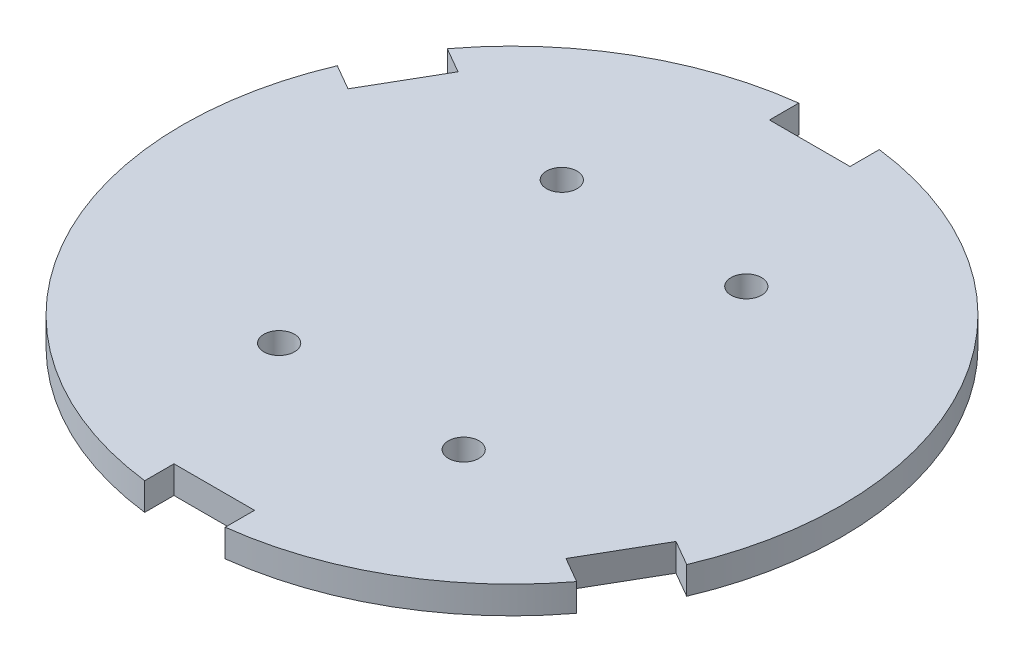
ISO-10303-21;
HEADER;
FILE_DESCRIPTION(('STEP AP214'),'2;1');
FILE_NAME('part.step','',(''),(''),'','','');
FILE_SCHEMA(('AUTOMOTIVE_DESIGN { 1 0 10303 214 1 1 1 1 }'));
ENDSEC;
DATA;
#1=APPLICATION_CONTEXT('core data for automotive mechanical design processes');
#2=APPLICATION_PROTOCOL_DEFINITION('international standard','automotive_design',2000,#1);
#3=PRODUCT_CONTEXT('',#1,'mechanical');
#4=PRODUCT('Part','Part','',(#3));
#5=PRODUCT_RELATED_PRODUCT_CATEGORY('part','',(#4));
#6=PRODUCT_DEFINITION_FORMATION('','',#4);
#7=PRODUCT_DEFINITION_CONTEXT('part definition',#1,'design');
#8=PRODUCT_DEFINITION('design','',#6,#7);
#9=PRODUCT_DEFINITION_SHAPE('','',#8);
#10=(LENGTH_UNIT() NAMED_UNIT(*) SI_UNIT(.MILLI.,.METRE.));
#11=(NAMED_UNIT(*) PLANE_ANGLE_UNIT() SI_UNIT($,.RADIAN.));
#12=(NAMED_UNIT(*) SI_UNIT($,.STERADIAN.) SOLID_ANGLE_UNIT());
#13=UNCERTAINTY_MEASURE_WITH_UNIT(LENGTH_MEASURE(1.E-05),#10,'distance_accuracy_value','');
#14=(GEOMETRIC_REPRESENTATION_CONTEXT(3) GLOBAL_UNCERTAINTY_ASSIGNED_CONTEXT((#13)) GLOBAL_UNIT_ASSIGNED_CONTEXT((#10,
#11,#12)) REPRESENTATION_CONTEXT('',''));
#15=CARTESIAN_POINT('',(0.,0.,0.));
#16=DIRECTION('',(0.,0.,1.));
#17=DIRECTION('',(1.,0.,0.));
#18=AXIS2_PLACEMENT_3D('',#15,#16,#17);
#19=CARTESIAN_POINT('',(0.,4.7625,0.));
#20=DIRECTION('',(0.,-1.,0.));
#21=DIRECTION('',(0.,0.,-1.));
#22=AXIS2_PLACEMENT_3D('',#19,#20,#21);
#23=CYLINDRICAL_SURFACE('',#22,57.15);
#24=CARTESIAN_POINT('',(0.,4.7625,0.));
#25=DIRECTION('',(0.,1.,0.));
#26=DIRECTION('',(0.,0.,1.));
#27=AXIS2_PLACEMENT_3D('',#24,#25,#26);
#28=CIRCLE('',#27,57.15);
#29=CARTESIAN_POINT('',(-52.6147882839347,4.7625,-22.3115789185061));
#30=VERTEX_POINT('',#29);
#31=CARTESIAN_POINT('',(-6.98500000000002,4.7625,56.7215327278803));
#32=VERTEX_POINT('',#31);
#33=EDGE_CURVE('E48',#30,#32,#28,.T.);
#34=ORIENTED_EDGE('',*,*,#33,.F.);
#35=DIRECTION('',(0.,1.,0.));
#36=VECTOR('',#35,1.);
#37=CARTESIAN_POINT('',(-52.6147882839347,-0.00100000000000013,-22.3115789185061));
#38=LINE('',#37,#36);
#39=CARTESIAN_POINT('',(-52.6147882839347,0.,-22.3115789185061));
#40=VERTEX_POINT('',#39);
#41=EDGE_CURVE('E259',#40,#30,#38,.T.);
#42=ORIENTED_EDGE('',*,*,#41,.F.);
#43=CARTESIAN_POINT('',(0.,0.,0.));
#44=DIRECTION('',(0.,1.,0.));
#45=DIRECTION('',(0.,0.,1.));
#46=AXIS2_PLACEMENT_3D('',#43,#44,#45);
#47=CIRCLE('',#46,57.15);
#48=CARTESIAN_POINT('',(-6.98500000000002,0.,56.7215327278803));
#49=VERTEX_POINT('',#48);
#50=EDGE_CURVE('E178',#40,#49,#47,.T.);
#51=ORIENTED_EDGE('',*,*,#50,.T.);
#52=DIRECTION('',(0.,1.,0.));
#53=VECTOR('',#52,1.);
#54=CARTESIAN_POINT('',(-6.98500000000002,-0.00100000000000013,56.7215327278803));
#55=LINE('',#54,#53);
#56=EDGE_CURVE('E201',#49,#32,#55,.T.);
#57=ORIENTED_EDGE('',*,*,#56,.T.);
#58=EDGE_LOOP('',(#34,#42,#51,#57));
#59=FACE_BOUND('',#58,.T.);
#60=ADVANCED_FACE('F38',(#59),#23,.T.);
#61=CARTESIAN_POINT('',(6.98500000000001,0.,56.7215327278803));
#62=VERTEX_POINT('',#61);
#63=CARTESIAN_POINT('',(45.6297882839347,0.,34.4099538093747));
#64=VERTEX_POINT('',#63);
#65=EDGE_CURVE('E42',#62,#64,#47,.T.);
#66=ORIENTED_EDGE('',*,*,#65,.T.);
#67=DIRECTION('',(0.,1.,0.));
#68=VECTOR('',#67,1.);
#69=CARTESIAN_POINT('',(45.6297882839347,-0.00100000000000013,34.4099538093747));
#70=LINE('',#69,#68);
#71=CARTESIAN_POINT('',(45.6297882839347,4.7625,34.4099538093747));
#72=VERTEX_POINT('',#71);
#73=EDGE_CURVE('E155',#64,#72,#70,.T.);
#74=ORIENTED_EDGE('',*,*,#73,.T.);
#75=CARTESIAN_POINT('',(6.98500000000001,4.7625,56.7215327278803));
#76=VERTEX_POINT('',#75);
#77=EDGE_CURVE('E11',#76,#72,#28,.T.);
#78=ORIENTED_EDGE('',*,*,#77,.F.);
#79=DIRECTION('',(0.,1.,0.));
#80=VECTOR('',#79,1.);
#81=CARTESIAN_POINT('',(6.98500000000001,-0.00100000000000013,56.7215327278803));
#82=LINE('',#81,#80);
#83=EDGE_CURVE('E175',#62,#76,#82,.T.);
#84=ORIENTED_EDGE('',*,*,#83,.F.);
#85=EDGE_LOOP('',(#66,#74,#78,#84));
#86=FACE_BOUND('',#85,.T.);
#87=ADVANCED_FACE('F174',(#86),#23,.T.);
#88=CARTESIAN_POINT('',(-6.98499999999999,0.,-56.7215327278803));
#89=VERTEX_POINT('',#88);
#90=CARTESIAN_POINT('',(-45.6297882839347,0.,-34.4099538093747));
#91=VERTEX_POINT('',#90);
#92=EDGE_CURVE('E177',#89,#91,#47,.T.);
#93=ORIENTED_EDGE('',*,*,#92,.T.);
#94=DIRECTION('',(0.,1.,0.));
#95=VECTOR('',#94,1.);
#96=CARTESIAN_POINT('',(-45.6297882839346,-0.00100000000000013,-34.4099538093747));
#97=LINE('',#96,#95);
#98=CARTESIAN_POINT('',(-45.6297882839346,4.7625,-34.4099538093747));
#99=VERTEX_POINT('',#98);
#100=EDGE_CURVE('E64',#91,#99,#97,.T.);
#101=ORIENTED_EDGE('',*,*,#100,.T.);
#102=CARTESIAN_POINT('',(-6.98499999999999,4.7625,-56.7215327278803));
#103=VERTEX_POINT('',#102);
#104=EDGE_CURVE('E49',#103,#99,#28,.T.);
#105=ORIENTED_EDGE('',*,*,#104,.F.);
#106=DIRECTION('',(0.,1.,0.));
#107=VECTOR('',#106,1.);
#108=CARTESIAN_POINT('',(-6.98499999999999,-0.00100000000000013,-56.7215327278803));
#109=LINE('',#108,#107);
#110=EDGE_CURVE('E222',#89,#103,#109,.T.);
#111=ORIENTED_EDGE('',*,*,#110,.F.);
#112=EDGE_LOOP('',(#93,#101,#105,#111));
#113=FACE_BOUND('',#112,.T.);
#114=ADVANCED_FACE('F285',(#113),#23,.T.);
#115=CARTESIAN_POINT('',(52.6147882839347,4.7625,22.3115789185061));
#116=VERTEX_POINT('',#115);
#117=CARTESIAN_POINT('',(6.98499999999996,4.7625,-56.7215327278803));
#118=VERTEX_POINT('',#117);
#119=EDGE_CURVE('E47',#116,#118,#28,.T.);
#120=ORIENTED_EDGE('',*,*,#119,.F.);
#121=DIRECTION('',(0.,1.,0.));
#122=VECTOR('',#121,1.);
#123=CARTESIAN_POINT('',(52.6147882839347,-0.00100000000000013,22.3115789185061));
#124=LINE('',#123,#122);
#125=CARTESIAN_POINT('',(52.6147882839347,0.,22.3115789185061));
#126=VERTEX_POINT('',#125);
#127=EDGE_CURVE('E164',#126,#116,#124,.T.);
#128=ORIENTED_EDGE('',*,*,#127,.F.);
#129=CARTESIAN_POINT('',(6.98499999999997,0.,-56.7215327278804));
#130=VERTEX_POINT('',#129);
#131=EDGE_CURVE('E176',#126,#130,#47,.T.);
#132=ORIENTED_EDGE('',*,*,#131,.T.);
#133=DIRECTION('',(0.,1.,0.));
#134=VECTOR('',#133,1.);
#135=CARTESIAN_POINT('',(6.98499999999996,-0.00100000000000013,-56.7215327278803));
#136=LINE('',#135,#134);
#137=EDGE_CURVE('E224',#130,#118,#136,.T.);
#138=ORIENTED_EDGE('',*,*,#137,.T.);
#139=EDGE_LOOP('',(#120,#128,#132,#138));
#140=FACE_BOUND('',#139,.T.);
#141=ADVANCED_FACE('F40',(#140),#23,.T.);
#142=CARTESIAN_POINT('',(0.,4.7625,0.));
#143=DIRECTION('',(0.,1.,0.));
#144=DIRECTION('',(0.,0.,1.));
#145=AXIS2_PLACEMENT_3D('',#142,#143,#144);
#146=PLANE('',#145);
#147=CARTESIAN_POINT('',(16.002,4.7625,-24.638));
#148=DIRECTION('',(0.,1.,0.));
#149=DIRECTION('',(0.,0.,1.));
#150=AXIS2_PLACEMENT_3D('',#147,#148,#149);
#151=CIRCLE('',#150,2.6543);
#152=CARTESIAN_POINT('',(16.002,4.7625,-21.9837));
#153=VERTEX_POINT('',#152);
#154=EDGE_CURVE('E355',#153,#153,#151,.T.);
#155=ORIENTED_EDGE('',*,*,#154,.F.);
#156=EDGE_LOOP('',(#155));
#157=FACE_BOUND('',#156,.T.);
#158=CARTESIAN_POINT('',(16.002,4.7625,24.384));
#159=DIRECTION('',(0.,1.,0.));
#160=DIRECTION('',(0.,0.,1.));
#161=AXIS2_PLACEMENT_3D('',#158,#159,#160);
#162=CIRCLE('',#161,2.6543);
#163=CARTESIAN_POINT('',(16.002,4.7625,27.0383));
#164=VERTEX_POINT('',#163);
#165=EDGE_CURVE('E349',#164,#164,#162,.T.);
#166=ORIENTED_EDGE('',*,*,#165,.F.);
#167=EDGE_LOOP('',(#166));
#168=FACE_BOUND('',#167,.T.);
#169=CARTESIAN_POINT('',(-16.002,4.7625,24.384));
#170=DIRECTION('',(0.,1.,0.));
#171=DIRECTION('',(0.,0.,1.));
#172=AXIS2_PLACEMENT_3D('',#169,#170,#171);
#173=CIRCLE('',#172,2.6543);
#174=CARTESIAN_POINT('',(-16.002,4.7625,27.0383));
#175=VERTEX_POINT('',#174);
#176=EDGE_CURVE('E343',#175,#175,#173,.T.);
#177=ORIENTED_EDGE('',*,*,#176,.F.);
#178=EDGE_LOOP('',(#177));
#179=FACE_BOUND('',#178,.T.);
#180=CARTESIAN_POINT('',(-16.002,4.7625,-24.638));
#181=DIRECTION('',(0.,1.,0.));
#182=DIRECTION('',(0.,0.,1.));
#183=AXIS2_PLACEMENT_3D('',#180,#181,#182);
#184=CIRCLE('',#183,2.6543);
#185=CARTESIAN_POINT('',(-16.002,4.7625,-21.9837));
#186=VERTEX_POINT('',#185);
#187=EDGE_CURVE('E337',#186,#186,#184,.T.);
#188=ORIENTED_EDGE('',*,*,#187,.F.);
#189=EDGE_LOOP('',(#188));
#190=FACE_BOUND('',#189,.T.);
#191=DIRECTION('',(0.866025403784436,0.,0.500000000000004));
#192=VECTOR('',#191,1.);
#193=CARTESIAN_POINT('',(41.2303792327097,4.7625,31.8699538093747));
#194=LINE('',#193,#192);
#195=CARTESIAN_POINT('',(41.2303792327097,4.7625,31.8699538093747));
#196=VERTEX_POINT('',#195);
#197=EDGE_CURVE('E160',#196,#72,#194,.T.);
#198=ORIENTED_EDGE('',*,*,#197,.F.);
#199=DIRECTION('',(-0.500000000000024,0.,0.866025403784425));
#200=VECTOR('',#199,1.);
#201=CARTESIAN_POINT('',(41.2303792327097,4.7625,31.8699538093747));
#202=LINE('',#201,#200);
#203=CARTESIAN_POINT('',(48.2153792327101,4.7625,19.7715789185062));
#204=VERTEX_POINT('',#203);
#205=EDGE_CURVE('E165',#204,#196,#202,.T.);
#206=ORIENTED_EDGE('',*,*,#205,.F.);
#207=DIRECTION('',(-0.866025403784436,0.,-0.500000000000005));
#208=VECTOR('',#207,1.);
#209=CARTESIAN_POINT('',(48.2153792327101,4.7625,19.7715789185062));
#210=LINE('',#209,#208);
#211=EDGE_CURVE('E328',#116,#204,#210,.T.);
#212=ORIENTED_EDGE('',*,*,#211,.F.);
#213=ORIENTED_EDGE('',*,*,#119,.T.);
#214=DIRECTION('',(0.,0.,-1.));
#215=VECTOR('',#214,1.);
#216=CARTESIAN_POINT('',(6.98499999999998,4.7625,-51.6415327278803));
#217=LINE('',#216,#215);
#218=CARTESIAN_POINT('',(6.98499999999998,4.7625,-51.6415327278803));
#219=VERTEX_POINT('',#218);
#220=EDGE_CURVE('E212',#219,#118,#217,.T.);
#221=ORIENTED_EDGE('',*,*,#220,.F.);
#222=DIRECTION('',(1.,0.,0.));
#223=VECTOR('',#222,1.);
#224=CARTESIAN_POINT('',(-6.98499999999999,4.7625,-51.6415327278803));
#225=LINE('',#224,#223);
#226=CARTESIAN_POINT('',(-6.98499999999999,4.7625,-51.6415327278803));
#227=VERTEX_POINT('',#226);
#228=EDGE_CURVE('E209',#227,#219,#225,.T.);
#229=ORIENTED_EDGE('',*,*,#228,.F.);
#230=DIRECTION('',(0.,0.,1.));
#231=VECTOR('',#230,1.);
#232=CARTESIAN_POINT('',(-6.98499999999999,4.7625,-51.6415327278803));
#233=LINE('',#232,#231);
#234=EDGE_CURVE('E215',#103,#227,#233,.T.);
#235=ORIENTED_EDGE('',*,*,#234,.F.);
#236=ORIENTED_EDGE('',*,*,#104,.T.);
#237=DIRECTION('',(-0.866025403784435,0.,-0.500000000000005));
#238=VECTOR('',#237,1.);
#239=CARTESIAN_POINT('',(-41.2303792327097,4.7625,-31.8699538093747));
#240=LINE('',#239,#238);
#241=CARTESIAN_POINT('',(-41.2303792327097,4.7625,-31.8699538093747));
#242=VERTEX_POINT('',#241);
#243=EDGE_CURVE('E305',#242,#99,#240,.T.);
#244=ORIENTED_EDGE('',*,*,#243,.F.);
#245=DIRECTION('',(0.500000000000004,0.,-0.866025403784436));
#246=VECTOR('',#245,1.);
#247=CARTESIAN_POINT('',(-48.2153792327098,4.7625,-19.7715789185061));
#248=LINE('',#247,#246);
#249=CARTESIAN_POINT('',(-48.2153792327098,4.7625,-19.7715789185061));
#250=VERTEX_POINT('',#249);
#251=EDGE_CURVE('E314',#250,#242,#248,.T.);
#252=ORIENTED_EDGE('',*,*,#251,.F.);
#253=DIRECTION('',(0.866025403784436,0.,0.500000000000004));
#254=VECTOR('',#253,1.);
#255=CARTESIAN_POINT('',(-48.2153792327098,4.7625,-19.7715789185061));
#256=LINE('',#255,#254);
#257=EDGE_CURVE('E309',#30,#250,#256,.T.);
#258=ORIENTED_EDGE('',*,*,#257,.F.);
#259=ORIENTED_EDGE('',*,*,#33,.T.);
#260=DIRECTION('',(0.,0.,1.));
#261=VECTOR('',#260,1.);
#262=CARTESIAN_POINT('',(-6.98499999999999,4.7625,51.6415327278803));
#263=LINE('',#262,#261);
#264=CARTESIAN_POINT('',(-6.98499999999999,4.7625,51.6415327278803));
#265=VERTEX_POINT('',#264);
#266=EDGE_CURVE('E245',#265,#32,#263,.T.);
#267=ORIENTED_EDGE('',*,*,#266,.F.);
#268=DIRECTION('',(-1.,0.,0.));
#269=VECTOR('',#268,1.);
#270=CARTESIAN_POINT('',(-6.98499999999999,4.7625,51.6415327278803));
#271=LINE('',#270,#269);
#272=CARTESIAN_POINT('',(6.98500000000001,4.7625,51.6415327278803));
#273=VERTEX_POINT('',#272);
#274=EDGE_CURVE('E197',#273,#265,#271,.T.);
#275=ORIENTED_EDGE('',*,*,#274,.F.);
#276=DIRECTION('',(0.,0.,-1.));
#277=VECTOR('',#276,1.);
#278=CARTESIAN_POINT('',(6.98500000000001,4.7625,51.6415327278803));
#279=LINE('',#278,#277);
#280=EDGE_CURVE('E246',#76,#273,#279,.T.);
#281=ORIENTED_EDGE('',*,*,#280,.F.);
#282=ORIENTED_EDGE('',*,*,#77,.T.);
#283=EDGE_LOOP('',(#198,#206,#212,#213,#221,#229,#235,#236,#244,#252,#258,#259,#267,#275,#281,#282));
#284=FACE_BOUND('',#283,.T.);
#285=ADVANCED_FACE('F254',(#157,#168,#179,#190,#284),#146,.T.);
#286=CARTESIAN_POINT('',(0.,0.,0.));
#287=DIRECTION('',(0.,1.,0.));
#288=DIRECTION('',(0.,0.,1.));
#289=AXIS2_PLACEMENT_3D('',#286,#287,#288);
#290=PLANE('',#289);
#291=CARTESIAN_POINT('',(16.002,0.,-24.638));
#292=DIRECTION('',(0.,1.,0.));
#293=DIRECTION('',(0.,0.,1.));
#294=AXIS2_PLACEMENT_3D('',#291,#292,#293);
#295=CIRCLE('',#294,2.6543);
#296=CARTESIAN_POINT('',(16.002,0.,-21.9837));
#297=VERTEX_POINT('',#296);
#298=EDGE_CURVE('E352',#297,#297,#295,.T.);
#299=ORIENTED_EDGE('',*,*,#298,.T.);
#300=EDGE_LOOP('',(#299));
#301=FACE_BOUND('',#300,.T.);
#302=CARTESIAN_POINT('',(16.002,0.,24.384));
#303=DIRECTION('',(0.,1.,0.));
#304=DIRECTION('',(0.,0.,1.));
#305=AXIS2_PLACEMENT_3D('',#302,#303,#304);
#306=CIRCLE('',#305,2.6543);
#307=CARTESIAN_POINT('',(16.002,0.,27.0383));
#308=VERTEX_POINT('',#307);
#309=EDGE_CURVE('E346',#308,#308,#306,.T.);
#310=ORIENTED_EDGE('',*,*,#309,.T.);
#311=EDGE_LOOP('',(#310));
#312=FACE_BOUND('',#311,.T.);
#313=CARTESIAN_POINT('',(-16.002,0.,24.384));
#314=DIRECTION('',(0.,1.,0.));
#315=DIRECTION('',(0.,0.,1.));
#316=AXIS2_PLACEMENT_3D('',#313,#314,#315);
#317=CIRCLE('',#316,2.6543);
#318=CARTESIAN_POINT('',(-16.002,0.,27.0383));
#319=VERTEX_POINT('',#318);
#320=EDGE_CURVE('E340',#319,#319,#317,.T.);
#321=ORIENTED_EDGE('',*,*,#320,.T.);
#322=EDGE_LOOP('',(#321));
#323=FACE_BOUND('',#322,.T.);
#324=CARTESIAN_POINT('',(-16.002,0.,-24.638));
#325=DIRECTION('',(0.,1.,0.));
#326=DIRECTION('',(0.,0.,1.));
#327=AXIS2_PLACEMENT_3D('',#324,#325,#326);
#328=CIRCLE('',#327,2.6543);
#329=CARTESIAN_POINT('',(-16.002,0.,-21.9837));
#330=VERTEX_POINT('',#329);
#331=EDGE_CURVE('E320',#330,#330,#328,.T.);
#332=ORIENTED_EDGE('',*,*,#331,.T.);
#333=EDGE_LOOP('',(#332));
#334=FACE_BOUND('',#333,.T.);
#335=DIRECTION('',(0.500000000000024,0.,-0.866025403784425));
#336=VECTOR('',#335,1.);
#337=CARTESIAN_POINT('',(41.2303792327097,0.,31.8699538093747));
#338=LINE('',#337,#336);
#339=CARTESIAN_POINT('',(41.2303792327097,0.,31.8699538093747));
#340=VERTEX_POINT('',#339);
#341=CARTESIAN_POINT('',(48.2153792327101,0.,19.7715789185062));
#342=VERTEX_POINT('',#341);
#343=EDGE_CURVE('E56',#340,#342,#338,.T.);
#344=ORIENTED_EDGE('',*,*,#343,.F.);
#345=DIRECTION('',(-0.866025403784436,0.,-0.500000000000004));
#346=VECTOR('',#345,1.);
#347=CARTESIAN_POINT('',(41.2303792327097,0.,31.8699538093747));
#348=LINE('',#347,#346);
#349=EDGE_CURVE('E158',#64,#340,#348,.T.);
#350=ORIENTED_EDGE('',*,*,#349,.F.);
#351=ORIENTED_EDGE('',*,*,#65,.F.);
#352=DIRECTION('',(0.,0.,1.));
#353=VECTOR('',#352,1.);
#354=CARTESIAN_POINT('',(6.98500000000001,0.,51.6415327278803));
#355=LINE('',#354,#353);
#356=CARTESIAN_POINT('',(6.98500000000001,0.,51.6415327278803));
#357=VERTEX_POINT('',#356);
#358=EDGE_CURVE('E229',#357,#62,#355,.T.);
#359=ORIENTED_EDGE('',*,*,#358,.F.);
#360=DIRECTION('',(1.,0.,0.));
#361=VECTOR('',#360,1.);
#362=CARTESIAN_POINT('',(-6.98499999999999,0.,51.6415327278803));
#363=LINE('',#362,#361);
#364=CARTESIAN_POINT('',(-6.98499999999999,0.,51.6415327278803));
#365=VERTEX_POINT('',#364);
#366=EDGE_CURVE('E234',#365,#357,#363,.T.);
#367=ORIENTED_EDGE('',*,*,#366,.F.);
#368=DIRECTION('',(0.,0.,-1.));
#369=VECTOR('',#368,1.);
#370=CARTESIAN_POINT('',(-6.98499999999999,0.,51.6415327278803));
#371=LINE('',#370,#369);
#372=EDGE_CURVE('E238',#49,#365,#371,.T.);
#373=ORIENTED_EDGE('',*,*,#372,.F.);
#374=ORIENTED_EDGE('',*,*,#50,.F.);
#375=DIRECTION('',(-0.866025403784436,0.,-0.500000000000004));
#376=VECTOR('',#375,1.);
#377=CARTESIAN_POINT('',(-48.2153792327098,0.,-19.7715789185061));
#378=LINE('',#377,#376);
#379=CARTESIAN_POINT('',(-48.2153792327098,0.,-19.7715789185061));
#380=VERTEX_POINT('',#379);
#381=EDGE_CURVE('E266',#380,#40,#378,.T.);
#382=ORIENTED_EDGE('',*,*,#381,.F.);
#383=DIRECTION('',(-0.500000000000004,0.,0.866025403784436));
#384=VECTOR('',#383,1.);
#385=CARTESIAN_POINT('',(-48.2153792327098,0.,-19.7715789185061));
#386=LINE('',#385,#384);
#387=CARTESIAN_POINT('',(-41.2303792327097,0.,-31.8699538093747));
#388=VERTEX_POINT('',#387);
#389=EDGE_CURVE('E318',#388,#380,#386,.T.);
#390=ORIENTED_EDGE('',*,*,#389,.F.);
#391=DIRECTION('',(0.866025403784435,0.,0.500000000000005));
#392=VECTOR('',#391,1.);
#393=CARTESIAN_POINT('',(-41.2303792327097,0.,-31.8699538093747));
#394=LINE('',#393,#392);
#395=EDGE_CURVE('E241',#91,#388,#394,.T.);
#396=ORIENTED_EDGE('',*,*,#395,.F.);
#397=ORIENTED_EDGE('',*,*,#92,.F.);
#398=DIRECTION('',(0.,0.,-1.));
#399=VECTOR('',#398,1.);
#400=CARTESIAN_POINT('',(-6.98499999999999,0.,-51.6415327278803));
#401=LINE('',#400,#399);
#402=CARTESIAN_POINT('',(-6.98499999999999,0.,-51.6415327278803));
#403=VERTEX_POINT('',#402);
#404=EDGE_CURVE('E206',#403,#89,#401,.T.);
#405=ORIENTED_EDGE('',*,*,#404,.F.);
#406=DIRECTION('',(-1.,0.,0.));
#407=VECTOR('',#406,1.);
#408=CARTESIAN_POINT('',(-6.98499999999999,0.,-51.6415327278803));
#409=LINE('',#408,#407);
#410=CARTESIAN_POINT('',(6.98499999999998,0.,-51.6415327278803));
#411=VERTEX_POINT('',#410);
#412=EDGE_CURVE('E203',#411,#403,#409,.T.);
#413=ORIENTED_EDGE('',*,*,#412,.F.);
#414=DIRECTION('',(0.,0.,1.));
#415=VECTOR('',#414,1.);
#416=CARTESIAN_POINT('',(6.98499999999998,0.,-51.6415327278803));
#417=LINE('',#416,#415);
#418=EDGE_CURVE('E221',#130,#411,#417,.T.);
#419=ORIENTED_EDGE('',*,*,#418,.F.);
#420=ORIENTED_EDGE('',*,*,#131,.F.);
#421=DIRECTION('',(0.866025403784436,0.,0.500000000000005));
#422=VECTOR('',#421,1.);
#423=CARTESIAN_POINT('',(48.2153792327101,0.,19.7715789185062));
#424=LINE('',#423,#422);
#425=EDGE_CURVE('E333',#342,#126,#424,.T.);
#426=ORIENTED_EDGE('',*,*,#425,.F.);
#427=EDGE_LOOP('',(#344,#350,#351,#359,#367,#373,#374,#382,#390,#396,#397,#405,#413,#419,#420,#426));
#428=FACE_BOUND('',#427,.T.);
#429=ADVANCED_FACE('F169',(#301,#312,#323,#334,#428),#290,.F.);
#430=CARTESIAN_POINT('',(-6.98499999999999,-0.00100000000000013,-51.6415327278803));
#431=DIRECTION('',(0.,0.,1.));
#432=DIRECTION('',(1.,0.,0.));
#433=AXIS2_PLACEMENT_3D('',#430,#431,#432);
#434=PLANE('',#433);
#435=ORIENTED_EDGE('',*,*,#412,.T.);
#436=DIRECTION('',(0.,1.,0.));
#437=VECTOR('',#436,1.);
#438=CARTESIAN_POINT('',(-6.98499999999999,-0.00100000000000013,-51.6415327278803));
#439=LINE('',#438,#437);
#440=EDGE_CURVE('E219',#403,#227,#439,.T.);
#441=ORIENTED_EDGE('',*,*,#440,.T.);
#442=ORIENTED_EDGE('',*,*,#228,.T.);
#443=DIRECTION('',(0.,1.,0.));
#444=VECTOR('',#443,1.);
#445=CARTESIAN_POINT('',(6.98499999999998,-0.00100000000000013,-51.6415327278803));
#446=LINE('',#445,#444);
#447=EDGE_CURVE('E218',#411,#219,#446,.T.);
#448=ORIENTED_EDGE('',*,*,#447,.F.);
#449=EDGE_LOOP('',(#435,#441,#442,#448));
#450=FACE_BOUND('',#449,.T.);
#451=ADVANCED_FACE('F400',(#450),#434,.F.);
#452=CARTESIAN_POINT('',(-6.98499999999999,-0.00100000000000013,-51.6415327278803));
#453=DIRECTION('',(-1.,0.,0.));
#454=DIRECTION('',(0.,0.,1.));
#455=AXIS2_PLACEMENT_3D('',#452,#453,#454);
#456=PLANE('',#455);
#457=ORIENTED_EDGE('',*,*,#404,.T.);
#458=ORIENTED_EDGE('',*,*,#110,.T.);
#459=ORIENTED_EDGE('',*,*,#234,.T.);
#460=ORIENTED_EDGE('',*,*,#440,.F.);
#461=EDGE_LOOP('',(#457,#458,#459,#460));
#462=FACE_BOUND('',#461,.T.);
#463=ADVANCED_FACE('F398',(#462),#456,.F.);
#464=CARTESIAN_POINT('',(6.98499999999998,-0.00100000000000013,-51.6415327278803));
#465=DIRECTION('',(1.,0.,0.));
#466=DIRECTION('',(0.,0.,-1.));
#467=AXIS2_PLACEMENT_3D('',#464,#465,#466);
#468=PLANE('',#467);
#469=ORIENTED_EDGE('',*,*,#418,.T.);
#470=ORIENTED_EDGE('',*,*,#447,.T.);
#471=ORIENTED_EDGE('',*,*,#220,.T.);
#472=ORIENTED_EDGE('',*,*,#137,.F.);
#473=EDGE_LOOP('',(#469,#470,#471,#472));
#474=FACE_BOUND('',#473,.T.);
#475=ADVANCED_FACE('F401',(#474),#468,.F.);
#476=CARTESIAN_POINT('',(-6.98499999999999,-0.00100000000000013,51.6415327278803));
#477=DIRECTION('',(-1.,0.,0.));
#478=DIRECTION('',(0.,0.,1.));
#479=AXIS2_PLACEMENT_3D('',#476,#477,#478);
#480=PLANE('',#479);
#481=ORIENTED_EDGE('',*,*,#372,.T.);
#482=DIRECTION('',(0.,1.,0.));
#483=VECTOR('',#482,1.);
#484=CARTESIAN_POINT('',(-6.98499999999999,-0.00100000000000013,51.6415327278803));
#485=LINE('',#484,#483);
#486=EDGE_CURVE('E183',#365,#265,#485,.T.);
#487=ORIENTED_EDGE('',*,*,#486,.T.);
#488=ORIENTED_EDGE('',*,*,#266,.T.);
#489=ORIENTED_EDGE('',*,*,#56,.F.);
#490=EDGE_LOOP('',(#481,#487,#488,#489));
#491=FACE_BOUND('',#490,.T.);
#492=ADVANCED_FACE('F257',(#491),#480,.F.);
#493=CARTESIAN_POINT('',(-6.98499999999999,-0.00100000000000013,51.6415327278803));
#494=DIRECTION('',(0.,0.,-1.));
#495=DIRECTION('',(-1.,0.,0.));
#496=AXIS2_PLACEMENT_3D('',#493,#494,#495);
#497=PLANE('',#496);
#498=ORIENTED_EDGE('',*,*,#366,.T.);
#499=DIRECTION('',(0.,1.,0.));
#500=VECTOR('',#499,1.);
#501=CARTESIAN_POINT('',(6.98500000000001,-0.00100000000000013,51.6415327278803));
#502=LINE('',#501,#500);
#503=EDGE_CURVE('E189',#357,#273,#502,.T.);
#504=ORIENTED_EDGE('',*,*,#503,.T.);
#505=ORIENTED_EDGE('',*,*,#274,.T.);
#506=ORIENTED_EDGE('',*,*,#486,.F.);
#507=EDGE_LOOP('',(#498,#504,#505,#506));
#508=FACE_BOUND('',#507,.T.);
#509=ADVANCED_FACE('F252',(#508),#497,.F.);
#510=CARTESIAN_POINT('',(6.98500000000001,-0.00100000000000013,51.6415327278803));
#511=DIRECTION('',(1.,0.,0.));
#512=DIRECTION('',(0.,0.,-1.));
#513=AXIS2_PLACEMENT_3D('',#510,#511,#512);
#514=PLANE('',#513);
#515=ORIENTED_EDGE('',*,*,#358,.T.);
#516=ORIENTED_EDGE('',*,*,#83,.T.);
#517=ORIENTED_EDGE('',*,*,#280,.T.);
#518=ORIENTED_EDGE('',*,*,#503,.F.);
#519=EDGE_LOOP('',(#515,#516,#517,#518));
#520=FACE_BOUND('',#519,.T.);
#521=ADVANCED_FACE('F268',(#520),#514,.F.);
#522=CARTESIAN_POINT('',(-48.2153792327098,-0.00100000000000013,-19.7715789185061));
#523=DIRECTION('',(0.866025403784436,0.,0.500000000000004));
#524=DIRECTION('',(0.500000000000004,0.,-0.866025403784436));
#525=AXIS2_PLACEMENT_3D('',#522,#523,#524);
#526=PLANE('',#525);
#527=ORIENTED_EDGE('',*,*,#389,.T.);
#528=DIRECTION('',(0.,1.,0.));
#529=VECTOR('',#528,1.);
#530=CARTESIAN_POINT('',(-48.2153792327098,-0.00100000000000013,-19.7715789185061));
#531=LINE('',#530,#529);
#532=EDGE_CURVE('E262',#380,#250,#531,.T.);
#533=ORIENTED_EDGE('',*,*,#532,.T.);
#534=ORIENTED_EDGE('',*,*,#251,.T.);
#535=DIRECTION('',(0.,1.,0.));
#536=VECTOR('',#535,1.);
#537=CARTESIAN_POINT('',(-41.2303792327097,-0.00100000000000013,-31.8699538093747));
#538=LINE('',#537,#536);
#539=EDGE_CURVE('E307',#388,#242,#538,.T.);
#540=ORIENTED_EDGE('',*,*,#539,.F.);
#541=EDGE_LOOP('',(#527,#533,#534,#540));
#542=FACE_BOUND('',#541,.T.);
#543=ADVANCED_FACE('F270',(#542),#526,.F.);
#544=CARTESIAN_POINT('',(-48.2153792327098,-0.00100000000000013,-19.7715789185061));
#545=DIRECTION('',(-0.500000000000004,0.,0.866025403784436));
#546=DIRECTION('',(0.866025403784436,0.,0.500000000000004));
#547=AXIS2_PLACEMENT_3D('',#544,#545,#546);
#548=PLANE('',#547);
#549=ORIENTED_EDGE('',*,*,#381,.T.);
#550=ORIENTED_EDGE('',*,*,#41,.T.);
#551=ORIENTED_EDGE('',*,*,#257,.T.);
#552=ORIENTED_EDGE('',*,*,#532,.F.);
#553=EDGE_LOOP('',(#549,#550,#551,#552));
#554=FACE_BOUND('',#553,.T.);
#555=ADVANCED_FACE('F276',(#554),#548,.F.);
#556=CARTESIAN_POINT('',(-41.2303792327097,-0.00100000000000013,-31.8699538093747));
#557=DIRECTION('',(0.500000000000005,0.,-0.866025403784435));
#558=DIRECTION('',(-0.866025403784435,0.,-0.500000000000005));
#559=AXIS2_PLACEMENT_3D('',#556,#557,#558);
#560=PLANE('',#559);
#561=ORIENTED_EDGE('',*,*,#395,.T.);
#562=ORIENTED_EDGE('',*,*,#539,.T.);
#563=ORIENTED_EDGE('',*,*,#243,.T.);
#564=ORIENTED_EDGE('',*,*,#100,.F.);
#565=EDGE_LOOP('',(#561,#562,#563,#564));
#566=FACE_BOUND('',#565,.T.);
#567=ADVANCED_FACE('F390',(#566),#560,.F.);
#568=CARTESIAN_POINT('',(41.2303792327097,-0.00100000000000013,31.8699538093747));
#569=DIRECTION('',(-0.500000000000004,0.,0.866025403784436));
#570=DIRECTION('',(0.866025403784436,0.,0.500000000000004));
#571=AXIS2_PLACEMENT_3D('',#568,#569,#570);
#572=PLANE('',#571);
#573=ORIENTED_EDGE('',*,*,#349,.T.);
#574=DIRECTION('',(0.,1.,0.));
#575=VECTOR('',#574,1.);
#576=CARTESIAN_POINT('',(41.2303792327097,-0.00100000000000013,31.8699538093747));
#577=LINE('',#576,#575);
#578=EDGE_CURVE('E207',#340,#196,#577,.T.);
#579=ORIENTED_EDGE('',*,*,#578,.T.);
#580=ORIENTED_EDGE('',*,*,#197,.T.);
#581=ORIENTED_EDGE('',*,*,#73,.F.);
#582=EDGE_LOOP('',(#573,#579,#580,#581));
#583=FACE_BOUND('',#582,.T.);
#584=ADVANCED_FACE('F157',(#583),#572,.F.);
#585=CARTESIAN_POINT('',(41.2303792327097,-0.00100000000000013,31.8699538093747));
#586=DIRECTION('',(-0.866025403784425,0.,-0.500000000000024));
#587=DIRECTION('',(-0.500000000000024,0.,0.866025403784425));
#588=AXIS2_PLACEMENT_3D('',#585,#586,#587);
#589=PLANE('',#588);
#590=ORIENTED_EDGE('',*,*,#343,.T.);
#591=DIRECTION('',(0.,1.,0.));
#592=VECTOR('',#591,1.);
#593=CARTESIAN_POINT('',(48.2153792327101,-0.00100000000000013,19.7715789185062));
#594=LINE('',#593,#592);
#595=EDGE_CURVE('E323',#342,#204,#594,.T.);
#596=ORIENTED_EDGE('',*,*,#595,.T.);
#597=ORIENTED_EDGE('',*,*,#205,.T.);
#598=ORIENTED_EDGE('',*,*,#578,.F.);
#599=EDGE_LOOP('',(#590,#596,#597,#598));
#600=FACE_BOUND('',#599,.T.);
#601=ADVANCED_FACE('F380',(#600),#589,.F.);
#602=CARTESIAN_POINT('',(48.2153792327101,-0.00100000000000013,19.7715789185062));
#603=DIRECTION('',(0.500000000000005,0.,-0.866025403784436));
#604=DIRECTION('',(-0.866025403784436,0.,-0.500000000000005));
#605=AXIS2_PLACEMENT_3D('',#602,#603,#604);
#606=PLANE('',#605);
#607=ORIENTED_EDGE('',*,*,#425,.T.);
#608=ORIENTED_EDGE('',*,*,#127,.T.);
#609=ORIENTED_EDGE('',*,*,#211,.T.);
#610=ORIENTED_EDGE('',*,*,#595,.F.);
#611=EDGE_LOOP('',(#607,#608,#609,#610));
#612=FACE_BOUND('',#611,.T.);
#613=ADVANCED_FACE('F370',(#612),#606,.F.);
#614=CARTESIAN_POINT('',(-16.002,4.7625,-24.638));
#615=DIRECTION('',(0.,1.,0.));
#616=DIRECTION('',(0.,0.,1.));
#617=AXIS2_PLACEMENT_3D('',#614,#615,#616);
#618=CYLINDRICAL_SURFACE('',#617,2.6543);
#619=ORIENTED_EDGE('',*,*,#331,.F.);
#620=EDGE_LOOP('',(#619));
#621=FACE_BOUND('',#620,.T.);
#622=ORIENTED_EDGE('',*,*,#187,.T.);
#623=EDGE_LOOP('',(#622));
#624=FACE_BOUND('',#623,.T.);
#625=ADVANCED_FACE('F367',(#621,#624),#618,.F.);
#626=CARTESIAN_POINT('',(-16.002,4.7625,24.384));
#627=DIRECTION('',(0.,1.,0.));
#628=DIRECTION('',(0.,0.,1.));
#629=AXIS2_PLACEMENT_3D('',#626,#627,#628);
#630=CYLINDRICAL_SURFACE('',#629,2.6543);
#631=ORIENTED_EDGE('',*,*,#320,.F.);
#632=EDGE_LOOP('',(#631));
#633=FACE_BOUND('',#632,.T.);
#634=ORIENTED_EDGE('',*,*,#176,.T.);
#635=EDGE_LOOP('',(#634));
#636=FACE_BOUND('',#635,.T.);
#637=ADVANCED_FACE('F369',(#633,#636),#630,.F.);
#638=CARTESIAN_POINT('',(16.002,4.7625,24.384));
#639=DIRECTION('',(0.,1.,0.));
#640=DIRECTION('',(0.,0.,1.));
#641=AXIS2_PLACEMENT_3D('',#638,#639,#640);
#642=CYLINDRICAL_SURFACE('',#641,2.6543);
#643=ORIENTED_EDGE('',*,*,#309,.F.);
#644=EDGE_LOOP('',(#643));
#645=FACE_BOUND('',#644,.T.);
#646=ORIENTED_EDGE('',*,*,#165,.T.);
#647=EDGE_LOOP('',(#646));
#648=FACE_BOUND('',#647,.T.);
#649=ADVANCED_FACE('F377',(#645,#648),#642,.F.);
#650=CARTESIAN_POINT('',(16.002,4.7625,-24.638));
#651=DIRECTION('',(0.,1.,0.));
#652=DIRECTION('',(0.,0.,1.));
#653=AXIS2_PLACEMENT_3D('',#650,#651,#652);
#654=CYLINDRICAL_SURFACE('',#653,2.6543);
#655=ORIENTED_EDGE('',*,*,#298,.F.);
#656=EDGE_LOOP('',(#655));
#657=FACE_BOUND('',#656,.T.);
#658=ORIENTED_EDGE('',*,*,#154,.T.);
#659=EDGE_LOOP('',(#658));
#660=FACE_BOUND('',#659,.T.);
#661=ADVANCED_FACE('F359',(#657,#660),#654,.F.);
#662=CLOSED_SHELL('',(#60,#87,#114,#141,#285,#429,#451,#463,#475,#492,#509,#521,#543,#555,#567,
#584,#601,#613,#625,#637,#649,#661));
#663=MANIFOLD_SOLID_BREP('B2',#662);
#664=ADVANCED_BREP_SHAPE_REPRESENTATION('',(#18,#663),#14);
#665=SHAPE_DEFINITION_REPRESENTATION(#9,#664);
ENDSEC;
END-ISO-10303-21;
